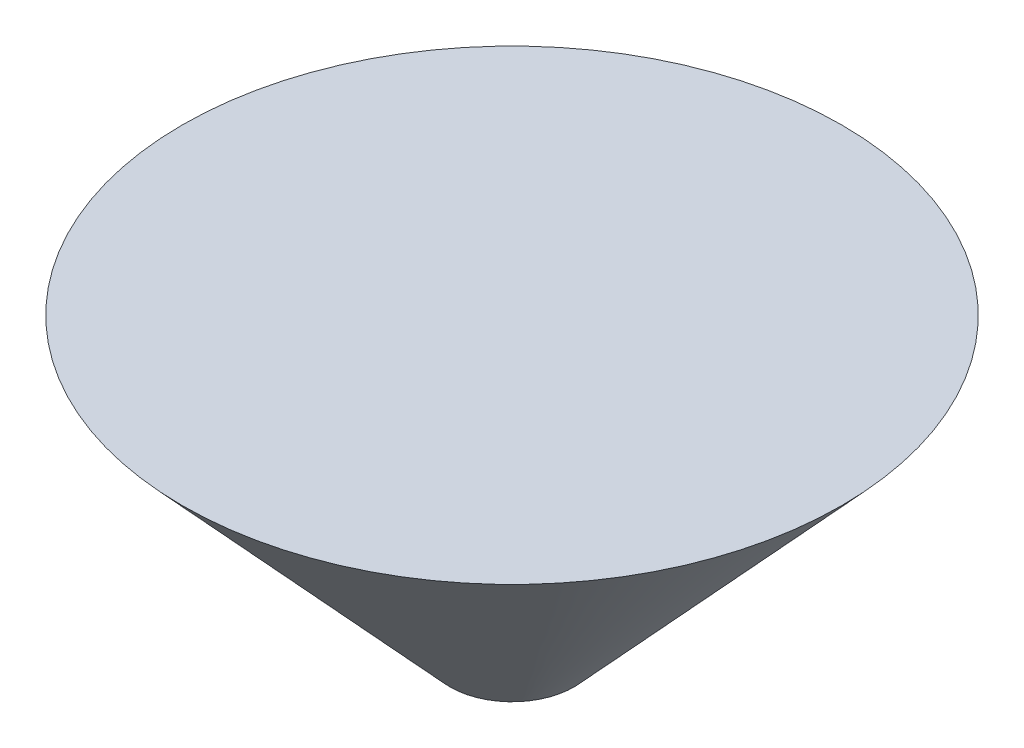
ISO-10303-21;
HEADER;
FILE_DESCRIPTION(('STEP AP214'),'2;1');
FILE_NAME('part.step','',(''),(''),'','','');
FILE_SCHEMA(('AUTOMOTIVE_DESIGN { 1 0 10303 214 1 1 1 1 }'));
ENDSEC;
DATA;
#1=APPLICATION_CONTEXT('core data for automotive mechanical design processes');
#2=APPLICATION_PROTOCOL_DEFINITION('international standard','automotive_design',2000,#1);
#3=PRODUCT_CONTEXT('',#1,'mechanical');
#4=PRODUCT('Part','Part','',(#3));
#5=PRODUCT_RELATED_PRODUCT_CATEGORY('part','',(#4));
#6=PRODUCT_DEFINITION_FORMATION('','',#4);
#7=PRODUCT_DEFINITION_CONTEXT('part definition',#1,'design');
#8=PRODUCT_DEFINITION('design','',#6,#7);
#9=PRODUCT_DEFINITION_SHAPE('','',#8);
#10=(LENGTH_UNIT() NAMED_UNIT(*) SI_UNIT(.MILLI.,.METRE.));
#11=(NAMED_UNIT(*) PLANE_ANGLE_UNIT() SI_UNIT($,.RADIAN.));
#12=(NAMED_UNIT(*) SI_UNIT($,.STERADIAN.) SOLID_ANGLE_UNIT());
#13=UNCERTAINTY_MEASURE_WITH_UNIT(LENGTH_MEASURE(1.E-05),#10,'distance_accuracy_value','');
#14=(GEOMETRIC_REPRESENTATION_CONTEXT(3) GLOBAL_UNCERTAINTY_ASSIGNED_CONTEXT((#13)) GLOBAL_UNIT_ASSIGNED_CONTEXT((#10,
#11,#12)) REPRESENTATION_CONTEXT('',''));
#15=CARTESIAN_POINT('',(0.,0.,0.));
#16=DIRECTION('',(0.,0.,1.));
#17=DIRECTION('',(1.,0.,0.));
#18=AXIS2_PLACEMENT_3D('',#15,#16,#17);
#19=CARTESIAN_POINT('',(0.,0.,0.));
#20=DIRECTION('',(0.,1.,0.));
#21=DIRECTION('',(0.,0.,1.));
#22=AXIS2_PLACEMENT_3D('',#19,#20,#21);
#23=PLANE('',#22);
#24=CARTESIAN_POINT('',(0.,0.,0.));
#25=DIRECTION('',(0.,-1.,0.));
#26=DIRECTION('',(0.,0.,-1.));
#27=AXIS2_PLACEMENT_3D('',#24,#25,#26);
#28=CIRCLE('',#27,17.);
#29=CARTESIAN_POINT('',(0.,0.,17.));
#30=VERTEX_POINT('',#29);
#31=EDGE_CURVE('E10',#30,#30,#28,.T.);
#32=ORIENTED_EDGE('',*,*,#31,.F.);
#33=EDGE_LOOP('',(#32));
#34=FACE_BOUND('',#33,.T.);
#35=ADVANCED_FACE('F31',(#34),#23,.T.);
#36=CARTESIAN_POINT('',(0.,-15.,0.));
#37=DIRECTION('',(0.,1.,0.));
#38=DIRECTION('',(0.,0.,1.));
#39=AXIS2_PLACEMENT_3D('',#36,#37,#38);
#40=CONICAL_SURFACE('',#39,3.2,0.74375558429886);
#41=CARTESIAN_POINT('',(0.,-15.,0.));
#42=DIRECTION('',(0.,-1.,0.));
#43=DIRECTION('',(0.,0.,-1.));
#44=AXIS2_PLACEMENT_3D('',#41,#42,#43);
#45=CIRCLE('',#44,3.2);
#46=CARTESIAN_POINT('',(0.,-15.,3.2));
#47=VERTEX_POINT('',#46);
#48=EDGE_CURVE('E37',#47,#47,#45,.T.);
#49=CARTESIAN_POINT('',(0.,0.,17.));
#50=CARTESIAN_POINT('',(0.,-0.156250000000001,16.85625));
#51=CARTESIAN_POINT('',(0.,-0.312500000000001,16.7125));
#52=CARTESIAN_POINT('',(0.,-0.625,16.425));
#53=CARTESIAN_POINT('',(0.,-0.78125,16.28125));
#54=CARTESIAN_POINT('',(0.,-1.09375,15.99375));
#55=CARTESIAN_POINT('',(0.,-1.25,15.85));
#56=CARTESIAN_POINT('',(0.,-1.5625,15.5625));
#57=CARTESIAN_POINT('',(0.,-1.71875,15.41875));
#58=CARTESIAN_POINT('',(0.,-2.03125,15.13125));
#59=CARTESIAN_POINT('',(0.,-2.1875,14.9875));
#60=CARTESIAN_POINT('',(0.,-2.5,14.7));
#61=CARTESIAN_POINT('',(0.,-2.65625,14.55625));
#62=CARTESIAN_POINT('',(0.,-2.96875,14.26875));
#63=CARTESIAN_POINT('',(0.,-3.125,14.125));
#64=CARTESIAN_POINT('',(0.,-3.4375,13.8375));
#65=CARTESIAN_POINT('',(0.,-3.59375,13.69375));
#66=CARTESIAN_POINT('',(0.,-3.90625,13.40625));
#67=CARTESIAN_POINT('',(0.,-4.0625,13.2625));
#68=CARTESIAN_POINT('',(0.,-4.375,12.975));
#69=CARTESIAN_POINT('',(0.,-4.53125,12.83125));
#70=CARTESIAN_POINT('',(0.,-4.84375,12.54375));
#71=CARTESIAN_POINT('',(0.,-5.,12.4));
#72=CARTESIAN_POINT('',(0.,-5.3125,12.1125));
#73=CARTESIAN_POINT('',(0.,-5.46875,11.96875));
#74=CARTESIAN_POINT('',(0.,-5.78125,11.68125));
#75=CARTESIAN_POINT('',(0.,-5.9375,11.5375));
#76=CARTESIAN_POINT('',(0.,-6.25,11.25));
#77=CARTESIAN_POINT('',(0.,-6.40625,11.10625));
#78=CARTESIAN_POINT('',(0.,-6.71875,10.81875));
#79=CARTESIAN_POINT('',(0.,-6.875,10.675));
#80=CARTESIAN_POINT('',(0.,-7.1875,10.3875));
#81=CARTESIAN_POINT('',(0.,-7.34375,10.24375));
#82=CARTESIAN_POINT('',(0.,-7.65625,9.95625));
#83=CARTESIAN_POINT('',(0.,-7.8125,9.8125));
#84=CARTESIAN_POINT('',(0.,-8.125,9.525));
#85=CARTESIAN_POINT('',(0.,-8.28125,9.38125));
#86=CARTESIAN_POINT('',(0.,-8.59375,9.09375));
#87=CARTESIAN_POINT('',(0.,-8.75,8.95));
#88=CARTESIAN_POINT('',(0.,-9.0625,8.6625));
#89=CARTESIAN_POINT('',(0.,-9.21875,8.51875));
#90=CARTESIAN_POINT('',(0.,-9.53125,8.23125));
#91=CARTESIAN_POINT('',(0.,-9.6875,8.0875));
#92=CARTESIAN_POINT('',(0.,-10.,7.8));
#93=CARTESIAN_POINT('',(0.,-10.15625,7.65625));
#94=CARTESIAN_POINT('',(0.,-10.46875,7.36875));
#95=CARTESIAN_POINT('',(0.,-10.625,7.225));
#96=CARTESIAN_POINT('',(0.,-10.9375,6.9375));
#97=CARTESIAN_POINT('',(0.,-11.09375,6.79375));
#98=CARTESIAN_POINT('',(0.,-11.40625,6.50625));
#99=CARTESIAN_POINT('',(0.,-11.5625,6.3625));
#100=CARTESIAN_POINT('',(0.,-11.875,6.075));
#101=CARTESIAN_POINT('',(0.,-12.03125,5.93125));
#102=CARTESIAN_POINT('',(0.,-12.34375,5.64375));
#103=CARTESIAN_POINT('',(0.,-12.5,5.5));
#104=CARTESIAN_POINT('',(0.,-12.8125,5.2125));
#105=CARTESIAN_POINT('',(0.,-12.96875,5.06875));
#106=CARTESIAN_POINT('',(0.,-13.28125,4.78125));
#107=CARTESIAN_POINT('',(0.,-13.4375,4.6375));
#108=CARTESIAN_POINT('',(0.,-13.75,4.35));
#109=CARTESIAN_POINT('',(0.,-13.90625,4.20625));
#110=CARTESIAN_POINT('',(0.,-14.21875,3.91875));
#111=CARTESIAN_POINT('',(0.,-14.375,3.775));
#112=CARTESIAN_POINT('',(0.,-14.6875,3.4875));
#113=CARTESIAN_POINT('',(0.,-14.84375,3.34375));
#114=CARTESIAN_POINT('',(0.,-15.,3.2));
#115=B_SPLINE_CURVE_WITH_KNOTS('',3,(#49,#50,#51,#52,#53,#54,#55,#56,#57,#58,#59,#60,#61,#62,
#63,#64,#65,#66,#67,#68,#69,#70,#71,#72,#73,#74,#75,#76,#77,#78,#79,#80,#81,#82,#83,#84,#85,#86,
#87,#88,#89,#90,#91,#92,#93,#94,#95,#96,#97,#98,#99,#100,#101,#102,#103,#104,#105,#106,#107,
#108,#109,#110,#111,#112,#113,#114),.UNSPECIFIED.,.F.,.F.,(4,2,2,2,2,2,2,2,2,2,2,2,2,2,2,2,2,2,
2,2,2,2,2,2,2,2,2,2,2,2,2,2,4),(0.,0.636948290679862,1.27389658135973,1.91084487203959,
2.54779316271945,3.18474145339932,3.82168974407918,4.45863803475904,5.09558632543891,
5.73253461611877,6.36948290679864,7.0064311974785,7.64337948815836,8.28032777883823,
8.91727606951809,9.55422436019795,10.1911726508778,10.8281209415577,11.4650692322375,
12.1020175229174,12.7389658135973,13.3759141042771,14.012862394957,14.6498106856369,
15.2867589763167,15.9237072669966,16.5606555576765,17.1976038483563,17.8345521390362,
18.471500429716,19.1084487203959,19.7453970110758,20.3823453017556),.UNSPECIFIED.);
#116=EDGE_CURVE('BSEAM45',#30,#47,#115,.T.);
#117=ORIENTED_EDGE('',*,*,#31,.T.);
#118=ORIENTED_EDGE('',*,*,#48,.F.);
#119=ORIENTED_EDGE('',*,*,#116,.T.);
#120=ORIENTED_EDGE('',*,*,#116,.F.);
#121=EDGE_LOOP('',(#117,#119,#118,#120));
#122=FACE_BOUND('',#121,.T.);
#123=ADVANCED_FACE('F45',(#122),#40,.T.);
#124=CARTESIAN_POINT('',(3.2,-15.,0.));
#125=DIRECTION('',(0.,-1.,0.));
#126=DIRECTION('',(0.,0.,-1.));
#127=AXIS2_PLACEMENT_3D('',#124,#125,#126);
#128=PLANE('',#127);
#129=ORIENTED_EDGE('',*,*,#48,.T.);
#130=EDGE_LOOP('',(#129));
#131=FACE_BOUND('',#130,.T.);
#132=ADVANCED_FACE('F43',(#131),#128,.T.);
#133=CLOSED_SHELL('',(#35,#123,#132));
#134=MANIFOLD_SOLID_BREP('B2',#133);
#135=ADVANCED_BREP_SHAPE_REPRESENTATION('',(#18,#134),#14);
#136=SHAPE_DEFINITION_REPRESENTATION(#9,#135);
ENDSEC;
END-ISO-10303-21;
